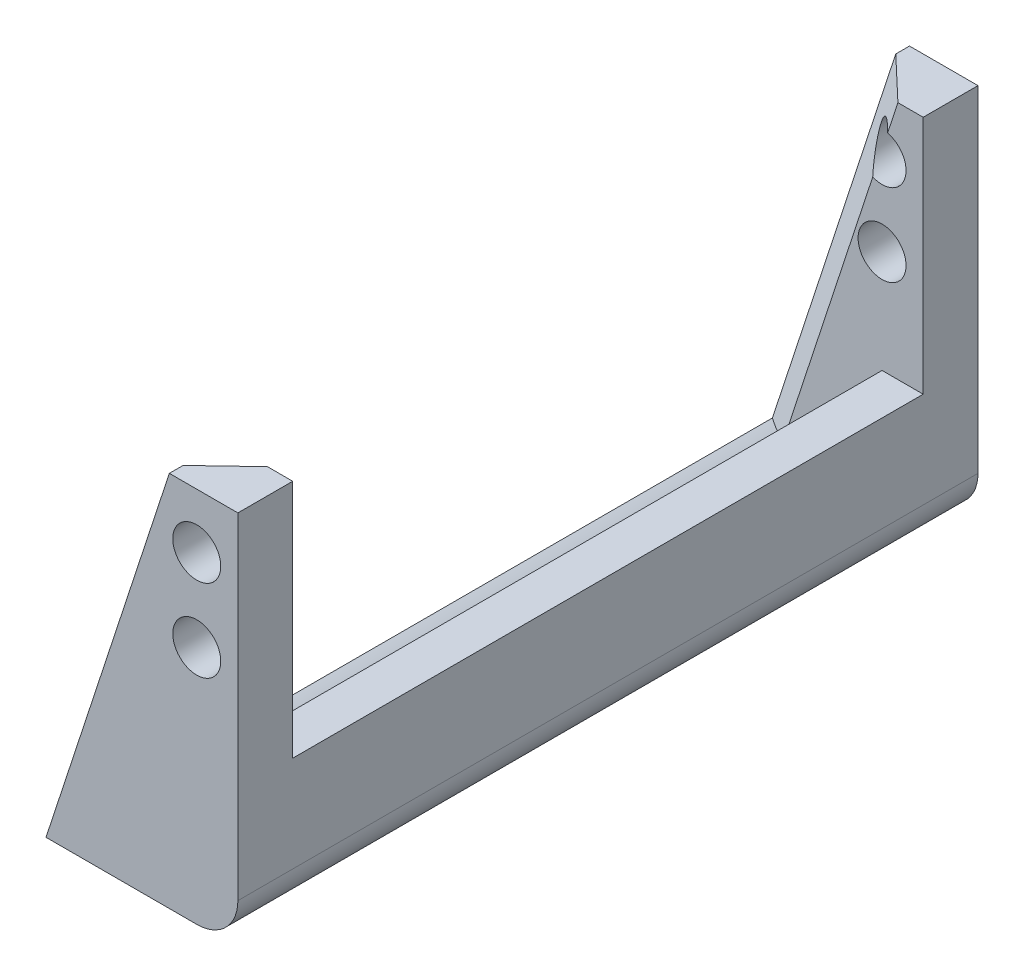
ISO-10303-21;
HEADER;
FILE_DESCRIPTION(('STEP AP214'),'2;1');
FILE_NAME('part.step','',(''),(''),'','','');
FILE_SCHEMA(('AUTOMOTIVE_DESIGN { 1 0 10303 214 1 1 1 1 }'));
ENDSEC;
DATA;
#1=APPLICATION_CONTEXT('core data for automotive mechanical design processes');
#2=APPLICATION_PROTOCOL_DEFINITION('international standard','automotive_design',2000,#1);
#3=PRODUCT_CONTEXT('',#1,'mechanical');
#4=PRODUCT('Part','Part','',(#3));
#5=PRODUCT_RELATED_PRODUCT_CATEGORY('part','',(#4));
#6=PRODUCT_DEFINITION_FORMATION('','',#4);
#7=PRODUCT_DEFINITION_CONTEXT('part definition',#1,'design');
#8=PRODUCT_DEFINITION('design','',#6,#7);
#9=PRODUCT_DEFINITION_SHAPE('','',#8);
#10=(LENGTH_UNIT() NAMED_UNIT(*) SI_UNIT(.MILLI.,.METRE.));
#11=(NAMED_UNIT(*) PLANE_ANGLE_UNIT() SI_UNIT($,.RADIAN.));
#12=(NAMED_UNIT(*) SI_UNIT($,.STERADIAN.) SOLID_ANGLE_UNIT());
#13=UNCERTAINTY_MEASURE_WITH_UNIT(LENGTH_MEASURE(1.E-05),#10,'distance_accuracy_value','');
#14=(GEOMETRIC_REPRESENTATION_CONTEXT(3) GLOBAL_UNCERTAINTY_ASSIGNED_CONTEXT((#13)) GLOBAL_UNIT_ASSIGNED_CONTEXT((#10,
#11,#12)) REPRESENTATION_CONTEXT('',''));
#15=CARTESIAN_POINT('',(0.,0.,0.));
#16=DIRECTION('',(0.,0.,1.));
#17=DIRECTION('',(1.,0.,0.));
#18=AXIS2_PLACEMENT_3D('',#15,#16,#17);
#19=CARTESIAN_POINT('',(-8.07066306145731,19.927729367603,23.));
#20=DIRECTION('',(0.,0.,-1.));
#21=DIRECTION('',(-1.,0.,0.));
#22=AXIS2_PLACEMENT_3D('',#19,#20,#21);
#23=CYLINDRICAL_SURFACE('',#22,21.5);
#24=CARTESIAN_POINT('',(-8.07066306145731,19.927729367603,-23.));
#25=DIRECTION('',(0.,0.,-1.));
#26=DIRECTION('',(1.,0.,0.));
#27=AXIS2_PLACEMENT_3D('',#24,#25,#26);
#28=CIRCLE('',#27,21.5);
#29=CARTESIAN_POINT('',(11.,10.,-23.));
#30=VERTEX_POINT('',#29);
#31=CARTESIAN_POINT('',(3.81497190262251,2.01176772719302,-23.));
#32=VERTEX_POINT('',#31);
#33=EDGE_CURVE('E212',#30,#32,#28,.T.);
#34=ORIENTED_EDGE('',*,*,#33,.T.);
#35=CARTESIAN_POINT('',(-8.07066306145731,19.927729367603,-39.8686372217923));
#36=DIRECTION('',(-0.672032254767727,0.219937828833074,0.707106781186546));
#37=DIRECTION('',(-0.672032254767725,0.219937828833074,-0.707106781186549));
#38=AXIS2_PLACEMENT_3D('',#35,#36,#37);
#39=ELLIPSE('',#38,30.4055915910216,21.5);
#40=CARTESIAN_POINT('',(0.,0.,-26.));
#41=VERTEX_POINT('',#40);
#42=EDGE_CURVE('E11',#32,#41,#39,.F.);
#43=ORIENTED_EDGE('',*,*,#42,.T.);
#44=DIRECTION('',(0.,0.,-1.));
#45=VECTOR('',#44,1.);
#46=CARTESIAN_POINT('',(0.,0.,23.));
#47=LINE('',#46,#45);
#48=CARTESIAN_POINT('',(0.,0.,26.));
#49=VERTEX_POINT('',#48);
#50=EDGE_CURVE('E147',#49,#41,#47,.T.);
#51=ORIENTED_EDGE('',*,*,#50,.F.);
#52=CARTESIAN_POINT('',(-8.07066306145731,19.927729367603,39.8686372217922));
#53=DIRECTION('',(0.672032254767724,-0.219937828833073,0.707106781186549));
#54=DIRECTION('',(0.672032254767727,-0.219937828833074,-0.707106781186546));
#55=AXIS2_PLACEMENT_3D('',#52,#53,#54);
#56=ELLIPSE('',#55,30.4055915910215,21.5);
#57=CARTESIAN_POINT('',(3.81497190262252,2.01176772719302,23.));
#58=VERTEX_POINT('',#57);
#59=EDGE_CURVE('E48',#49,#58,#56,.T.);
#60=ORIENTED_EDGE('',*,*,#59,.T.);
#61=CARTESIAN_POINT('',(-8.07066306145731,19.927729367603,23.));
#62=DIRECTION('',(0.,0.,-1.));
#63=DIRECTION('',(1.,0.,0.));
#64=AXIS2_PLACEMENT_3D('',#61,#62,#63);
#65=CIRCLE('',#64,21.5);
#66=CARTESIAN_POINT('',(11.,10.,23.));
#67=VERTEX_POINT('',#66);
#68=EDGE_CURVE('E213',#67,#58,#65,.T.);
#69=ORIENTED_EDGE('',*,*,#68,.F.);
#70=DIRECTION('',(0.,0.,-1.));
#71=VECTOR('',#70,1.);
#72=CARTESIAN_POINT('',(11.,10.,23.));
#73=LINE('',#72,#71);
#74=EDGE_CURVE('E220',#67,#30,#73,.T.);
#75=ORIENTED_EDGE('',*,*,#74,.T.);
#76=EDGE_LOOP('',(#34,#43,#51,#60,#69,#75));
#77=FACE_BOUND('',#76,.T.);
#78=ADVANCED_FACE('F39',(#77),#23,.F.);
#79=CARTESIAN_POINT('',(0.,0.,23.));
#80=DIRECTION('',(0.,1.,0.));
#81=DIRECTION('',(0.,0.,1.));
#82=AXIS2_PLACEMENT_3D('',#79,#80,#81);
#83=PLANE('',#82);
#84=DIRECTION('',(1.,0.,0.));
#85=VECTOR('',#84,1.);
#86=CARTESIAN_POINT('',(0.,0.,-27.));
#87=LINE('',#86,#85);
#88=CARTESIAN_POINT('',(0.,0.,-27.));
#89=VERTEX_POINT('',#88);
#90=CARTESIAN_POINT('',(11.,0.,-27.));
#91=VERTEX_POINT('',#90);
#92=EDGE_CURVE('E144',#89,#91,#87,.T.);
#93=ORIENTED_EDGE('',*,*,#92,.T.);
#94=DIRECTION('',(0.,0.,-1.));
#95=VECTOR('',#94,1.);
#96=CARTESIAN_POINT('',(11.,0.,23.));
#97=LINE('',#96,#95);
#98=CARTESIAN_POINT('',(11.,0.,27.));
#99=VERTEX_POINT('',#98);
#100=EDGE_CURVE('E235',#91,#99,#97,.F.);
#101=ORIENTED_EDGE('',*,*,#100,.T.);
#102=DIRECTION('',(1.,0.,0.));
#103=VECTOR('',#102,1.);
#104=CARTESIAN_POINT('',(0.,0.,27.));
#105=LINE('',#104,#103);
#106=CARTESIAN_POINT('',(0.,0.,27.));
#107=VERTEX_POINT('',#106);
#108=EDGE_CURVE('E191',#107,#99,#105,.T.);
#109=ORIENTED_EDGE('',*,*,#108,.F.);
#110=DIRECTION('',(0.,0.,-1.));
#111=VECTOR('',#110,1.);
#112=CARTESIAN_POINT('',(0.,0.,27.));
#113=LINE('',#112,#111);
#114=EDGE_CURVE('E201',#107,#49,#113,.T.);
#115=ORIENTED_EDGE('',*,*,#114,.T.);
#116=ORIENTED_EDGE('',*,*,#50,.T.);
#117=DIRECTION('',(0.,0.,1.));
#118=VECTOR('',#117,1.);
#119=CARTESIAN_POINT('',(0.,0.,-27.));
#120=LINE('',#119,#118);
#121=EDGE_CURVE('E141',#89,#41,#120,.T.);
#122=ORIENTED_EDGE('',*,*,#121,.F.);
#123=EDGE_LOOP('',(#93,#101,#109,#115,#116,#122));
#124=FACE_BOUND('',#123,.T.);
#125=ADVANCED_FACE('F143',(#124),#83,.F.);
#126=CARTESIAN_POINT('',(14.,0.,23.));
#127=DIRECTION('',(-1.,0.,0.));
#128=DIRECTION('',(0.,0.,1.));
#129=AXIS2_PLACEMENT_3D('',#126,#127,#128);
#130=PLANE('',#129);
#131=DIRECTION('',(0.,1.,0.));
#132=VECTOR('',#131,1.);
#133=CARTESIAN_POINT('',(14.,0.,27.));
#134=LINE('',#133,#132);
#135=CARTESIAN_POINT('',(14.,3.,27.));
#136=VERTEX_POINT('',#135);
#137=CARTESIAN_POINT('',(14.,27.5,27.));
#138=VERTEX_POINT('',#137);
#139=EDGE_CURVE('E194',#136,#138,#134,.T.);
#140=ORIENTED_EDGE('',*,*,#139,.F.);
#141=DIRECTION('',(0.,0.,-1.));
#142=VECTOR('',#141,1.);
#143=CARTESIAN_POINT('',(14.,3.,23.));
#144=LINE('',#143,#142);
#145=CARTESIAN_POINT('',(14.,3.,-27.));
#146=VERTEX_POINT('',#145);
#147=EDGE_CURVE('E231',#136,#146,#144,.T.);
#148=ORIENTED_EDGE('',*,*,#147,.T.);
#149=DIRECTION('',(0.,1.,0.));
#150=VECTOR('',#149,1.);
#151=CARTESIAN_POINT('',(14.,0.,-27.));
#152=LINE('',#151,#150);
#153=CARTESIAN_POINT('',(14.,27.5,-27.));
#154=VERTEX_POINT('',#153);
#155=EDGE_CURVE('E165',#146,#154,#152,.T.);
#156=ORIENTED_EDGE('',*,*,#155,.T.);
#157=DIRECTION('',(0.,0.,1.));
#158=VECTOR('',#157,1.);
#159=CARTESIAN_POINT('',(14.,27.5,-27.));
#160=LINE('',#159,#158);
#161=CARTESIAN_POINT('',(14.,27.5,-23.));
#162=VERTEX_POINT('',#161);
#163=EDGE_CURVE('E170',#154,#162,#160,.T.);
#164=ORIENTED_EDGE('',*,*,#163,.T.);
#165=DIRECTION('',(0.,1.,0.));
#166=VECTOR('',#165,1.);
#167=CARTESIAN_POINT('',(14.,0.,-23.));
#168=LINE('',#167,#166);
#169=CARTESIAN_POINT('',(14.,10.,-23.));
#170=VERTEX_POINT('',#169);
#171=EDGE_CURVE('E160',#170,#162,#168,.T.);
#172=ORIENTED_EDGE('',*,*,#171,.F.);
#173=DIRECTION('',(0.,0.,-1.));
#174=VECTOR('',#173,1.);
#175=CARTESIAN_POINT('',(14.,10.,23.));
#176=LINE('',#175,#174);
#177=CARTESIAN_POINT('',(14.,10.,23.));
#178=VERTEX_POINT('',#177);
#179=EDGE_CURVE('E227',#178,#170,#176,.T.);
#180=ORIENTED_EDGE('',*,*,#179,.F.);
#181=DIRECTION('',(0.,1.,0.));
#182=VECTOR('',#181,1.);
#183=CARTESIAN_POINT('',(14.,0.,23.));
#184=LINE('',#183,#182);
#185=CARTESIAN_POINT('',(14.,27.5,23.));
#186=VERTEX_POINT('',#185);
#187=EDGE_CURVE('E188',#178,#186,#184,.T.);
#188=ORIENTED_EDGE('',*,*,#187,.T.);
#189=DIRECTION('',(0.,0.,-1.));
#190=VECTOR('',#189,1.);
#191=CARTESIAN_POINT('',(14.,27.5,27.));
#192=LINE('',#191,#190);
#193=EDGE_CURVE('E209',#138,#186,#192,.T.);
#194=ORIENTED_EDGE('',*,*,#193,.F.);
#195=EDGE_LOOP('',(#140,#148,#156,#164,#172,#180,#188,#194));
#196=FACE_BOUND('',#195,.T.);
#197=ADVANCED_FACE('F296',(#196),#130,.F.);
#198=CARTESIAN_POINT('',(11.,10.,23.));
#199=DIRECTION('',(0.,-1.,0.));
#200=DIRECTION('',(0.,0.,-1.));
#201=AXIS2_PLACEMENT_3D('',#198,#199,#200);
#202=PLANE('',#201);
#203=DIRECTION('',(-1.,0.,0.));
#204=VECTOR('',#203,1.);
#205=CARTESIAN_POINT('',(11.,10.,-23.));
#206=LINE('',#205,#204);
#207=EDGE_CURVE('E217',#170,#30,#206,.T.);
#208=ORIENTED_EDGE('',*,*,#207,.T.);
#209=ORIENTED_EDGE('',*,*,#74,.F.);
#210=DIRECTION('',(-1.,0.,0.));
#211=VECTOR('',#210,1.);
#212=CARTESIAN_POINT('',(11.,10.,23.));
#213=LINE('',#212,#211);
#214=EDGE_CURVE('E216',#178,#67,#213,.T.);
#215=ORIENTED_EDGE('',*,*,#214,.F.);
#216=ORIENTED_EDGE('',*,*,#179,.T.);
#217=EDGE_LOOP('',(#208,#209,#215,#216));
#218=FACE_BOUND('',#217,.T.);
#219=ADVANCED_FACE('F305',(#218),#202,.F.);
#220=CARTESIAN_POINT('',(0.,0.,23.));
#221=DIRECTION('',(0.,0.,1.));
#222=DIRECTION('',(1.,0.,0.));
#223=AXIS2_PLACEMENT_3D('',#220,#221,#222);
#224=PLANE('',#223);
#225=ORIENTED_EDGE('',*,*,#68,.T.);
#226=DIRECTION('',(0.311039060414626,0.950397129044689,0.));
#227=VECTOR('',#226,1.);
#228=CARTESIAN_POINT('',(2.85119138713408,-0.93311718124388,23.));
#229=LINE('',#228,#227);
#230=CARTESIAN_POINT('',(10.3197914995741,21.887605384545,23.));
#231=VERTEX_POINT('',#230);
#232=EDGE_CURVE('E244',#58,#231,#229,.T.);
#233=ORIENTED_EDGE('',*,*,#232,.T.);
#234=CARTESIAN_POINT('',(11.,23.5,23.));
#235=DIRECTION('',(0.,0.,1.));
#236=DIRECTION('',(1.,0.,0.));
#237=AXIS2_PLACEMENT_3D('',#234,#235,#236);
#238=CIRCLE('',#237,1.75);
#239=CARTESIAN_POINT('',(11.404687422798,25.2025651499514,23.));
#240=VERTEX_POINT('',#239);
#241=EDGE_CURVE('E182',#231,#240,#238,.T.);
#242=ORIENTED_EDGE('',*,*,#241,.T.);
#243=DIRECTION('',(0.311039060414626,0.950397129044689,0.));
#244=VECTOR('',#243,1.);
#245=CARTESIAN_POINT('',(2.85119138713408,-0.93311718124388,23.));
#246=LINE('',#245,#244);
#247=CARTESIAN_POINT('',(12.1565751919048,27.5,23.));
#248=VERTEX_POINT('',#247);
#249=EDGE_CURVE('E242',#240,#248,#246,.T.);
#250=ORIENTED_EDGE('',*,*,#249,.T.);
#251=DIRECTION('',(-1.,0.,0.));
#252=VECTOR('',#251,1.);
#253=CARTESIAN_POINT('',(14.,27.5,23.));
#254=LINE('',#253,#252);
#255=EDGE_CURVE('E195',#186,#248,#254,.T.);
#256=ORIENTED_EDGE('',*,*,#255,.F.);
#257=ORIENTED_EDGE('',*,*,#187,.F.);
#258=ORIENTED_EDGE('',*,*,#214,.T.);
#259=EDGE_LOOP('',(#225,#233,#242,#250,#256,#257,#258));
#260=FACE_BOUND('',#259,.T.);
#261=CARTESIAN_POINT('',(11.,17.5,23.));
#262=DIRECTION('',(0.,0.,1.));
#263=DIRECTION('',(1.,0.,0.));
#264=AXIS2_PLACEMENT_3D('',#261,#262,#263);
#265=CIRCLE('',#264,1.75);
#266=CARTESIAN_POINT('',(12.75,17.5,23.));
#267=VERTEX_POINT('',#266);
#268=EDGE_CURVE('E149',#267,#267,#265,.T.);
#269=ORIENTED_EDGE('',*,*,#268,.T.);
#270=EDGE_LOOP('',(#269));
#271=FACE_BOUND('',#270,.T.);
#272=ADVANCED_FACE('F265',(#260,#271),#224,.F.);
#273=CARTESIAN_POINT('',(0.,0.,27.));
#274=DIRECTION('',(0.,0.,1.));
#275=DIRECTION('',(1.,0.,0.));
#276=AXIS2_PLACEMENT_3D('',#273,#274,#275);
#277=PLANE('',#276);
#278=CARTESIAN_POINT('',(11.,23.5,27.));
#279=DIRECTION('',(0.,0.,1.));
#280=DIRECTION('',(1.,0.,0.));
#281=AXIS2_PLACEMENT_3D('',#278,#279,#280);
#282=CIRCLE('',#281,1.75);
#283=CARTESIAN_POINT('',(12.75,23.5,27.));
#284=VERTEX_POINT('',#283);
#285=EDGE_CURVE('E185',#284,#284,#282,.T.);
#286=ORIENTED_EDGE('',*,*,#285,.F.);
#287=EDGE_LOOP('',(#286));
#288=FACE_BOUND('',#287,.T.);
#289=ORIENTED_EDGE('',*,*,#108,.T.);
#290=CARTESIAN_POINT('',(11.,3.,27.));
#291=DIRECTION('',(0.,0.,1.));
#292=DIRECTION('',(1.,0.,0.));
#293=AXIS2_PLACEMENT_3D('',#290,#291,#292);
#294=CIRCLE('',#293,3.);
#295=EDGE_CURVE('E237',#99,#136,#294,.T.);
#296=ORIENTED_EDGE('',*,*,#295,.T.);
#297=ORIENTED_EDGE('',*,*,#139,.T.);
#298=DIRECTION('',(-1.,0.,0.));
#299=VECTOR('',#298,1.);
#300=CARTESIAN_POINT('',(14.,27.5,27.));
#301=LINE('',#300,#299);
#302=CARTESIAN_POINT('',(9.,27.5,27.));
#303=VERTEX_POINT('',#302);
#304=EDGE_CURVE('E197',#138,#303,#301,.T.);
#305=ORIENTED_EDGE('',*,*,#304,.T.);
#306=DIRECTION('',(-0.311039060414625,-0.950397129044689,0.));
#307=VECTOR('',#306,1.);
#308=CARTESIAN_POINT('',(9.,27.5,27.));
#309=LINE('',#308,#307);
#310=EDGE_CURVE('E199',#303,#107,#309,.T.);
#311=ORIENTED_EDGE('',*,*,#310,.T.);
#312=EDGE_LOOP('',(#289,#296,#297,#305,#311));
#313=FACE_BOUND('',#312,.T.);
#314=CARTESIAN_POINT('',(11.,17.5,27.));
#315=DIRECTION('',(0.,0.,1.));
#316=DIRECTION('',(1.,0.,0.));
#317=AXIS2_PLACEMENT_3D('',#314,#315,#316);
#318=CIRCLE('',#317,1.75);
#319=CARTESIAN_POINT('',(12.75,17.5,27.));
#320=VERTEX_POINT('',#319);
#321=EDGE_CURVE('E179',#320,#320,#318,.T.);
#322=ORIENTED_EDGE('',*,*,#321,.F.);
#323=EDGE_LOOP('',(#322));
#324=FACE_BOUND('',#323,.T.);
#325=ADVANCED_FACE('F289',(#288,#313,#324),#277,.T.);
#326=CARTESIAN_POINT('',(14.,27.5,27.));
#327=DIRECTION('',(0.,-1.,0.));
#328=DIRECTION('',(1.,0.,0.));
#329=AXIS2_PLACEMENT_3D('',#326,#327,#328);
#330=PLANE('',#329);
#331=ORIENTED_EDGE('',*,*,#255,.T.);
#332=DIRECTION('',(0.724855676318005,0.,-0.688900753744375));
#333=VECTOR('',#332,1.);
#334=CARTESIAN_POINT('',(9.,27.5,26.));
#335=LINE('',#334,#333);
#336=CARTESIAN_POINT('',(9.,27.5,26.));
#337=VERTEX_POINT('',#336);
#338=EDGE_CURVE('E248',#248,#337,#335,.F.);
#339=ORIENTED_EDGE('',*,*,#338,.T.);
#340=DIRECTION('',(0.,0.,-1.));
#341=VECTOR('',#340,1.);
#342=CARTESIAN_POINT('',(9.,27.5,27.));
#343=LINE('',#342,#341);
#344=EDGE_CURVE('E206',#303,#337,#343,.T.);
#345=ORIENTED_EDGE('',*,*,#344,.F.);
#346=ORIENTED_EDGE('',*,*,#304,.F.);
#347=ORIENTED_EDGE('',*,*,#193,.T.);
#348=EDGE_LOOP('',(#331,#339,#345,#346,#347));
#349=FACE_BOUND('',#348,.T.);
#350=ADVANCED_FACE('F278',(#349),#330,.F.);
#351=CARTESIAN_POINT('',(9.,27.5,27.));
#352=DIRECTION('',(0.950397129044689,-0.311039060414626,0.));
#353=DIRECTION('',(0.311039060414626,0.950397129044689,0.));
#354=AXIS2_PLACEMENT_3D('',#351,#352,#353);
#355=PLANE('',#354);
#356=ORIENTED_EDGE('',*,*,#344,.T.);
#357=DIRECTION('',(-0.311039060414626,-0.950397129044689,0.));
#358=VECTOR('',#357,1.);
#359=CARTESIAN_POINT('',(9.,27.5,26.));
#360=LINE('',#359,#358);
#361=EDGE_CURVE('E239',#337,#49,#360,.T.);
#362=ORIENTED_EDGE('',*,*,#361,.T.);
#363=ORIENTED_EDGE('',*,*,#114,.F.);
#364=ORIENTED_EDGE('',*,*,#310,.F.);
#365=EDGE_LOOP('',(#356,#362,#363,#364));
#366=FACE_BOUND('',#365,.T.);
#367=ADVANCED_FACE('F284',(#366),#355,.F.);
#368=CARTESIAN_POINT('',(11.,23.5,27.));
#369=DIRECTION('',(0.,0.,-1.));
#370=DIRECTION('',(-1.,0.,0.));
#371=AXIS2_PLACEMENT_3D('',#368,#369,#370);
#372=CYLINDRICAL_SURFACE('',#371,1.75);
#373=ORIENTED_EDGE('',*,*,#285,.T.);
#374=EDGE_LOOP('',(#373));
#375=FACE_BOUND('',#374,.T.);
#376=ORIENTED_EDGE('',*,*,#241,.F.);
#377=CARTESIAN_POINT('',(11.,23.5,22.8550495002521));
#378=DIRECTION('',(0.672032254767724,-0.219937828833073,0.707106781186549));
#379=DIRECTION('',(0.672032254767727,-0.219937828833074,-0.707106781186546));
#380=AXIS2_PLACEMENT_3D('',#377,#378,#379);
#381=ELLIPSE('',#380,2.47487373415291,1.75);
#382=EDGE_CURVE('E246',#231,#240,#381,.F.);
#383=ORIENTED_EDGE('',*,*,#382,.T.);
#384=EDGE_LOOP('',(#376,#383));
#385=FACE_BOUND('',#384,.T.);
#386=ADVANCED_FACE('F275',(#375,#385),#372,.F.);
#387=CARTESIAN_POINT('',(11.,17.5,27.));
#388=DIRECTION('',(0.,0.,-1.));
#389=DIRECTION('',(-1.,0.,0.));
#390=AXIS2_PLACEMENT_3D('',#387,#388,#389);
#391=CYLINDRICAL_SURFACE('',#390,1.75);
#392=ORIENTED_EDGE('',*,*,#321,.T.);
#393=EDGE_LOOP('',(#392));
#394=FACE_BOUND('',#393,.T.);
#395=ORIENTED_EDGE('',*,*,#268,.F.);
#396=EDGE_LOOP('',(#395));
#397=FACE_BOUND('',#396,.T.);
#398=ADVANCED_FACE('F393',(#394,#397),#391,.F.);
#399=CARTESIAN_POINT('',(9.,27.5,-27.));
#400=DIRECTION('',(-0.950397129044689,0.311039060414626,0.));
#401=DIRECTION('',(-0.311039060414626,-0.950397129044689,0.));
#402=AXIS2_PLACEMENT_3D('',#399,#400,#401);
#403=PLANE('',#402);
#404=ORIENTED_EDGE('',*,*,#121,.T.);
#405=DIRECTION('',(0.311039060414626,0.950397129044689,0.));
#406=VECTOR('',#405,1.);
#407=CARTESIAN_POINT('',(9.,27.5,-26.));
#408=LINE('',#407,#406);
#409=CARTESIAN_POINT('',(9.,27.5,-26.));
#410=VERTEX_POINT('',#409);
#411=EDGE_CURVE('E55',#41,#410,#408,.T.);
#412=ORIENTED_EDGE('',*,*,#411,.T.);
#413=DIRECTION('',(0.,0.,1.));
#414=VECTOR('',#413,1.);
#415=CARTESIAN_POINT('',(9.,27.5,-27.));
#416=LINE('',#415,#414);
#417=CARTESIAN_POINT('',(9.,27.5,-27.));
#418=VERTEX_POINT('',#417);
#419=EDGE_CURVE('E150',#418,#410,#416,.T.);
#420=ORIENTED_EDGE('',*,*,#419,.F.);
#421=DIRECTION('',(-0.311039060414625,-0.950397129044689,0.));
#422=VECTOR('',#421,1.);
#423=CARTESIAN_POINT('',(9.,27.5,-27.));
#424=LINE('',#423,#422);
#425=EDGE_CURVE('E157',#418,#89,#424,.T.);
#426=ORIENTED_EDGE('',*,*,#425,.T.);
#427=EDGE_LOOP('',(#404,#412,#420,#426));
#428=FACE_BOUND('',#427,.T.);
#429=ADVANCED_FACE('F162',(#428),#403,.T.);
#430=CARTESIAN_POINT('',(14.,27.5,-27.));
#431=DIRECTION('',(0.,1.,0.));
#432=DIRECTION('',(-1.,0.,0.));
#433=AXIS2_PLACEMENT_3D('',#430,#431,#432);
#434=PLANE('',#433);
#435=ORIENTED_EDGE('',*,*,#419,.T.);
#436=DIRECTION('',(0.724855676318002,0.,0.688900753744378));
#437=VECTOR('',#436,1.);
#438=CARTESIAN_POINT('',(11.1277251356808,27.5,-23.9778161396528));
#439=LINE('',#438,#437);
#440=CARTESIAN_POINT('',(12.1565751919048,27.5,-23.));
#441=VERTEX_POINT('',#440);
#442=EDGE_CURVE('E257',#410,#441,#439,.T.);
#443=ORIENTED_EDGE('',*,*,#442,.T.);
#444=DIRECTION('',(-1.,0.,0.));
#445=VECTOR('',#444,1.);
#446=CARTESIAN_POINT('',(14.,27.5,-23.));
#447=LINE('',#446,#445);
#448=EDGE_CURVE('E171',#162,#441,#447,.T.);
#449=ORIENTED_EDGE('',*,*,#448,.F.);
#450=ORIENTED_EDGE('',*,*,#163,.F.);
#451=DIRECTION('',(-1.,0.,0.));
#452=VECTOR('',#451,1.);
#453=CARTESIAN_POINT('',(14.,27.5,-27.));
#454=LINE('',#453,#452);
#455=EDGE_CURVE('E163',#154,#418,#454,.T.);
#456=ORIENTED_EDGE('',*,*,#455,.T.);
#457=EDGE_LOOP('',(#435,#443,#449,#450,#456));
#458=FACE_BOUND('',#457,.T.);
#459=ADVANCED_FACE('F299',(#458),#434,.T.);
#460=CARTESIAN_POINT('',(0.,0.,-27.));
#461=DIRECTION('',(0.,0.,-1.));
#462=DIRECTION('',(1.,0.,0.));
#463=AXIS2_PLACEMENT_3D('',#460,#461,#462);
#464=PLANE('',#463);
#465=CARTESIAN_POINT('',(11.,17.5,-27.));
#466=DIRECTION('',(0.,0.,1.));
#467=DIRECTION('',(1.,0.,0.));
#468=AXIS2_PLACEMENT_3D('',#465,#466,#467);
#469=CIRCLE('',#468,1.75);
#470=CARTESIAN_POINT('',(12.75,17.5,-27.));
#471=VERTEX_POINT('',#470);
#472=EDGE_CURVE('E313',#471,#471,#469,.T.);
#473=ORIENTED_EDGE('',*,*,#472,.T.);
#474=EDGE_LOOP('',(#473));
#475=FACE_BOUND('',#474,.T.);
#476=CARTESIAN_POINT('',(11.,23.5,-27.));
#477=DIRECTION('',(0.,0.,1.));
#478=DIRECTION('',(1.,0.,0.));
#479=AXIS2_PLACEMENT_3D('',#476,#477,#478);
#480=CIRCLE('',#479,1.75);
#481=CARTESIAN_POINT('',(12.75,23.5,-27.));
#482=VERTEX_POINT('',#481);
#483=EDGE_CURVE('E174',#482,#482,#480,.T.);
#484=ORIENTED_EDGE('',*,*,#483,.T.);
#485=EDGE_LOOP('',(#484));
#486=FACE_BOUND('',#485,.T.);
#487=ORIENTED_EDGE('',*,*,#155,.F.);
#488=CARTESIAN_POINT('',(11.,3.,-27.));
#489=DIRECTION('',(0.,0.,-1.));
#490=DIRECTION('',(-1.,0.,0.));
#491=AXIS2_PLACEMENT_3D('',#488,#489,#490);
#492=CIRCLE('',#491,3.);
#493=EDGE_CURVE('E159',#146,#91,#492,.T.);
#494=ORIENTED_EDGE('',*,*,#493,.T.);
#495=ORIENTED_EDGE('',*,*,#92,.F.);
#496=ORIENTED_EDGE('',*,*,#425,.F.);
#497=ORIENTED_EDGE('',*,*,#455,.F.);
#498=EDGE_LOOP('',(#487,#494,#495,#496,#497));
#499=FACE_BOUND('',#498,.T.);
#500=ADVANCED_FACE('F155',(#475,#486,#499),#464,.T.);
#501=CARTESIAN_POINT('',(0.,0.,-23.));
#502=DIRECTION('',(0.,0.,-1.));
#503=DIRECTION('',(1.,0.,0.));
#504=AXIS2_PLACEMENT_3D('',#501,#502,#503);
#505=PLANE('',#504);
#506=CARTESIAN_POINT('',(11.,17.5,-23.));
#507=DIRECTION('',(0.,0.,1.));
#508=DIRECTION('',(1.,0.,0.));
#509=AXIS2_PLACEMENT_3D('',#506,#507,#508);
#510=CIRCLE('',#509,1.75);
#511=CARTESIAN_POINT('',(12.75,17.5,-23.));
#512=VERTEX_POINT('',#511);
#513=EDGE_CURVE('E317',#512,#512,#510,.T.);
#514=ORIENTED_EDGE('',*,*,#513,.F.);
#515=EDGE_LOOP('',(#514));
#516=FACE_BOUND('',#515,.T.);
#517=ORIENTED_EDGE('',*,*,#448,.T.);
#518=DIRECTION('',(-0.311039060414626,-0.950397129044689,0.));
#519=VECTOR('',#518,1.);
#520=CARTESIAN_POINT('',(2.85119138713407,-0.933117181243878,-23.));
#521=LINE('',#520,#519);
#522=CARTESIAN_POINT('',(11.404687422798,25.2025651499514,-23.));
#523=VERTEX_POINT('',#522);
#524=EDGE_CURVE('E252',#441,#523,#521,.T.);
#525=ORIENTED_EDGE('',*,*,#524,.T.);
#526=CARTESIAN_POINT('',(11.,23.5,-23.));
#527=DIRECTION('',(0.,0.,1.));
#528=DIRECTION('',(1.,0.,0.));
#529=AXIS2_PLACEMENT_3D('',#526,#527,#528);
#530=CIRCLE('',#529,1.75);
#531=CARTESIAN_POINT('',(10.3197914995741,21.887605384545,-23.));
#532=VERTEX_POINT('',#531);
#533=EDGE_CURVE('E311',#532,#523,#530,.T.);
#534=ORIENTED_EDGE('',*,*,#533,.F.);
#535=DIRECTION('',(-0.311039060414626,-0.950397129044689,0.));
#536=VECTOR('',#535,1.);
#537=CARTESIAN_POINT('',(2.85119138713407,-0.933117181243878,-23.));
#538=LINE('',#537,#536);
#539=EDGE_CURVE('E250',#532,#32,#538,.T.);
#540=ORIENTED_EDGE('',*,*,#539,.T.);
#541=ORIENTED_EDGE('',*,*,#33,.F.);
#542=ORIENTED_EDGE('',*,*,#207,.F.);
#543=ORIENTED_EDGE('',*,*,#171,.T.);
#544=EDGE_LOOP('',(#517,#525,#534,#540,#541,#542,#543));
#545=FACE_BOUND('',#544,.T.);
#546=ADVANCED_FACE('F310',(#516,#545),#505,.F.);
#547=CARTESIAN_POINT('',(11.,23.5,-27.));
#548=DIRECTION('',(0.,0.,1.));
#549=DIRECTION('',(1.,0.,0.));
#550=AXIS2_PLACEMENT_3D('',#547,#548,#549);
#551=CYLINDRICAL_SURFACE('',#550,1.75);
#552=ORIENTED_EDGE('',*,*,#483,.F.);
#553=EDGE_LOOP('',(#552));
#554=FACE_BOUND('',#553,.T.);
#555=ORIENTED_EDGE('',*,*,#533,.T.);
#556=CARTESIAN_POINT('',(11.,23.5,-22.8550495002521));
#557=DIRECTION('',(-0.672032254767727,0.219937828833074,0.707106781186546));
#558=DIRECTION('',(0.672032254767725,-0.219937828833074,0.707106781186549));
#559=AXIS2_PLACEMENT_3D('',#556,#557,#558);
#560=ELLIPSE('',#559,2.47487373415292,1.75);
#561=EDGE_CURVE('E62',#523,#532,#560,.T.);
#562=ORIENTED_EDGE('',*,*,#561,.T.);
#563=EDGE_LOOP('',(#555,#562));
#564=FACE_BOUND('',#563,.T.);
#565=ADVANCED_FACE('F312',(#554,#564),#551,.F.);
#566=CARTESIAN_POINT('',(11.,17.5,-27.));
#567=DIRECTION('',(0.,0.,1.));
#568=DIRECTION('',(1.,0.,0.));
#569=AXIS2_PLACEMENT_3D('',#566,#567,#568);
#570=CYLINDRICAL_SURFACE('',#569,1.75);
#571=ORIENTED_EDGE('',*,*,#472,.F.);
#572=EDGE_LOOP('',(#571));
#573=FACE_BOUND('',#572,.T.);
#574=ORIENTED_EDGE('',*,*,#513,.T.);
#575=EDGE_LOOP('',(#574));
#576=FACE_BOUND('',#575,.T.);
#577=ADVANCED_FACE('F323',(#573,#576),#570,.F.);
#578=CARTESIAN_POINT('',(11.,3.,23.));
#579=DIRECTION('',(0.,0.,-1.));
#580=DIRECTION('',(-1.,0.,0.));
#581=AXIS2_PLACEMENT_3D('',#578,#579,#580);
#582=CYLINDRICAL_SURFACE('',#581,3.);
#583=ORIENTED_EDGE('',*,*,#295,.F.);
#584=ORIENTED_EDGE('',*,*,#100,.F.);
#585=ORIENTED_EDGE('',*,*,#493,.F.);
#586=ORIENTED_EDGE('',*,*,#147,.F.);
#587=EDGE_LOOP('',(#583,#584,#585,#586));
#588=FACE_BOUND('',#587,.T.);
#589=ADVANCED_FACE('F294',(#588),#582,.T.);
#590=CARTESIAN_POINT('',(9.,27.5,26.));
#591=DIRECTION('',(0.672032254767724,-0.219937828833073,0.707106781186549));
#592=DIRECTION('',(-0.311039060414626,-0.950397129044689,0.));
#593=AXIS2_PLACEMENT_3D('',#590,#591,#592);
#594=PLANE('',#593);
#595=ORIENTED_EDGE('',*,*,#382,.F.);
#596=ORIENTED_EDGE('',*,*,#232,.F.);
#597=ORIENTED_EDGE('',*,*,#59,.F.);
#598=ORIENTED_EDGE('',*,*,#361,.F.);
#599=ORIENTED_EDGE('',*,*,#338,.F.);
#600=ORIENTED_EDGE('',*,*,#249,.F.);
#601=EDGE_LOOP('',(#595,#596,#597,#598,#599,#600));
#602=FACE_BOUND('',#601,.T.);
#603=ADVANCED_FACE('F271',(#602),#594,.F.);
#604=CARTESIAN_POINT('',(2.85119138713407,-0.933117181243878,-23.));
#605=DIRECTION('',(-0.672032254767727,0.219937828833074,0.707106781186546));
#606=DIRECTION('',(0.311039060414626,0.950397129044689,0.));
#607=AXIS2_PLACEMENT_3D('',#604,#605,#606);
#608=PLANE('',#607);
#609=ORIENTED_EDGE('',*,*,#442,.F.);
#610=ORIENTED_EDGE('',*,*,#411,.F.);
#611=ORIENTED_EDGE('',*,*,#42,.F.);
#612=ORIENTED_EDGE('',*,*,#539,.F.);
#613=ORIENTED_EDGE('',*,*,#561,.F.);
#614=ORIENTED_EDGE('',*,*,#524,.F.);
#615=EDGE_LOOP('',(#609,#610,#611,#612,#613,#614));
#616=FACE_BOUND('',#615,.T.);
#617=ADVANCED_FACE('F42',(#616),#608,.T.);
#618=CLOSED_SHELL('',(#78,#125,#197,#219,#272,#325,#350,#367,#386,#398,#429,#459,#500,#546,#565,
#577,#589,#603,#617));
#619=MANIFOLD_SOLID_BREP('B2',#618);
#620=ADVANCED_BREP_SHAPE_REPRESENTATION('',(#18,#619),#14);
#621=SHAPE_DEFINITION_REPRESENTATION(#9,#620);
ENDSEC;
END-ISO-10303-21;
